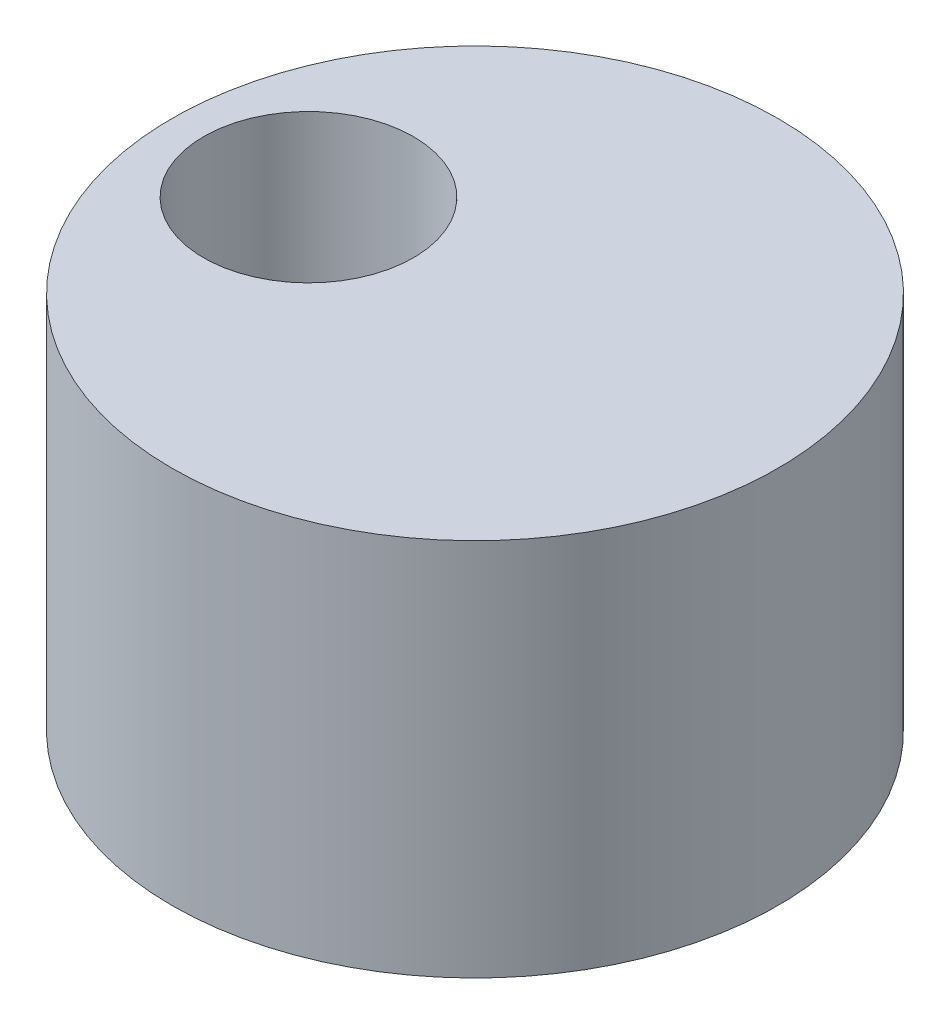
ISO-10303-21;
HEADER;
FILE_DESCRIPTION(('STEP AP214'),'2;1');
FILE_NAME('part.step','',(''),(''),'','','');
FILE_SCHEMA(('AUTOMOTIVE_DESIGN { 1 0 10303 214 1 1 1 1 }'));
ENDSEC;
DATA;
#1=APPLICATION_CONTEXT('core data for automotive mechanical design processes');
#2=APPLICATION_PROTOCOL_DEFINITION('international standard','automotive_design',2000,#1);
#3=PRODUCT_CONTEXT('',#1,'mechanical');
#4=PRODUCT('Part','Part','',(#3));
#5=PRODUCT_RELATED_PRODUCT_CATEGORY('part','',(#4));
#6=PRODUCT_DEFINITION_FORMATION('','',#4);
#7=PRODUCT_DEFINITION_CONTEXT('part definition',#1,'design');
#8=PRODUCT_DEFINITION('design','',#6,#7);
#9=PRODUCT_DEFINITION_SHAPE('','',#8);
#10=(LENGTH_UNIT() NAMED_UNIT(*) SI_UNIT(.MILLI.,.METRE.));
#11=(NAMED_UNIT(*) PLANE_ANGLE_UNIT() SI_UNIT($,.RADIAN.));
#12=(NAMED_UNIT(*) SI_UNIT($,.STERADIAN.) SOLID_ANGLE_UNIT());
#13=UNCERTAINTY_MEASURE_WITH_UNIT(LENGTH_MEASURE(1.E-05),#10,'distance_accuracy_value','');
#14=(GEOMETRIC_REPRESENTATION_CONTEXT(3) GLOBAL_UNCERTAINTY_ASSIGNED_CONTEXT((#13)) GLOBAL_UNIT_ASSIGNED_CONTEXT((#10,
#11,#12)) REPRESENTATION_CONTEXT('',''));
#15=CARTESIAN_POINT('',(0.,0.,0.));
#16=DIRECTION('',(0.,0.,1.));
#17=DIRECTION('',(1.,0.,0.));
#18=AXIS2_PLACEMENT_3D('',#15,#16,#17);
#19=CARTESIAN_POINT('',(0.,7.9375,0.));
#20=DIRECTION('',(0.,-1.,0.));
#21=DIRECTION('',(0.,0.,-1.));
#22=AXIS2_PLACEMENT_3D('',#19,#20,#21);
#23=CYLINDRICAL_SURFACE('',#22,6.35);
#24=CARTESIAN_POINT('',(0.,7.9375,0.));
#25=DIRECTION('',(0.,1.,0.));
#26=DIRECTION('',(0.,0.,1.));
#27=AXIS2_PLACEMENT_3D('',#24,#25,#26);
#28=CIRCLE('',#27,6.35);
#29=CARTESIAN_POINT('',(0.,7.9375,6.35));
#30=VERTEX_POINT('',#29);
#31=EDGE_CURVE('E10',#30,#30,#28,.T.);
#32=ORIENTED_EDGE('',*,*,#31,.F.);
#33=EDGE_LOOP('',(#32));
#34=FACE_BOUND('',#33,.T.);
#35=CARTESIAN_POINT('',(0.,0.,0.));
#36=DIRECTION('',(0.,1.,0.));
#37=DIRECTION('',(0.,0.,1.));
#38=AXIS2_PLACEMENT_3D('',#35,#36,#37);
#39=CIRCLE('',#38,6.35);
#40=CARTESIAN_POINT('',(0.,0.,6.35));
#41=VERTEX_POINT('',#40);
#42=EDGE_CURVE('E44',#41,#41,#39,.T.);
#43=ORIENTED_EDGE('',*,*,#42,.T.);
#44=EDGE_LOOP('',(#43));
#45=FACE_BOUND('',#44,.T.);
#46=ADVANCED_FACE('F41',(#34,#45),#23,.T.);
#47=CARTESIAN_POINT('',(0.,7.9375,0.));
#48=DIRECTION('',(0.,1.,0.));
#49=DIRECTION('',(0.,0.,1.));
#50=AXIS2_PLACEMENT_3D('',#47,#48,#49);
#51=PLANE('',#50);
#52=CARTESIAN_POINT('',(-3.49,7.9375,0.));
#53=DIRECTION('',(0.,-1.,0.));
#54=DIRECTION('',(0.,0.,-1.));
#55=AXIS2_PLACEMENT_3D('',#52,#53,#54);
#56=CIRCLE('',#55,2.2);
#57=CARTESIAN_POINT('',(-3.49,7.9375,-2.2));
#58=VERTEX_POINT('',#57);
#59=EDGE_CURVE('E53',#58,#58,#56,.T.);
#60=ORIENTED_EDGE('',*,*,#59,.T.);
#61=EDGE_LOOP('',(#60));
#62=FACE_BOUND('',#61,.T.);
#63=ORIENTED_EDGE('',*,*,#31,.T.);
#64=EDGE_LOOP('',(#63));
#65=FACE_BOUND('',#64,.T.);
#66=ADVANCED_FACE('F92',(#62,#65),#51,.T.);
#67=CARTESIAN_POINT('',(0.,0.,0.));
#68=DIRECTION('',(0.,1.,0.));
#69=DIRECTION('',(0.,0.,1.));
#70=AXIS2_PLACEMENT_3D('',#67,#68,#69);
#71=PLANE('',#70);
#72=CARTESIAN_POINT('',(-3.49,0.,-3.8));
#73=DIRECTION('',(0.,-1.,0.));
#74=DIRECTION('',(0.,0.,-1.));
#75=AXIS2_PLACEMENT_3D('',#72,#73,#74);
#76=CIRCLE('',#75,1.);
#77=CARTESIAN_POINT('',(-3.49,0.,-4.8));
#78=VERTEX_POINT('',#77);
#79=EDGE_CURVE('E71',#78,#78,#76,.T.);
#80=ORIENTED_EDGE('',*,*,#79,.F.);
#81=EDGE_LOOP('',(#80));
#82=FACE_BOUND('',#81,.T.);
#83=CARTESIAN_POINT('',(-3.49,0.,3.8));
#84=DIRECTION('',(0.,-1.,0.));
#85=DIRECTION('',(0.,0.,-1.));
#86=AXIS2_PLACEMENT_3D('',#83,#84,#85);
#87=CIRCLE('',#86,1.);
#88=CARTESIAN_POINT('',(-3.49,0.,2.8));
#89=VERTEX_POINT('',#88);
#90=EDGE_CURVE('E67',#89,#89,#87,.T.);
#91=ORIENTED_EDGE('',*,*,#90,.F.);
#92=EDGE_LOOP('',(#91));
#93=FACE_BOUND('',#92,.T.);
#94=CARTESIAN_POINT('',(-3.49,0.,0.));
#95=DIRECTION('',(0.,-1.,0.));
#96=DIRECTION('',(0.,0.,-1.));
#97=AXIS2_PLACEMENT_3D('',#94,#95,#96);
#98=CIRCLE('',#97,2.2);
#99=CARTESIAN_POINT('',(-3.49,0.,-2.2));
#100=VERTEX_POINT('',#99);
#101=EDGE_CURVE('E55',#100,#100,#98,.T.);
#102=ORIENTED_EDGE('',*,*,#101,.F.);
#103=EDGE_LOOP('',(#102));
#104=FACE_BOUND('',#103,.T.);
#105=ORIENTED_EDGE('',*,*,#42,.F.);
#106=EDGE_LOOP('',(#105));
#107=FACE_BOUND('',#106,.T.);
#108=ADVANCED_FACE('F88',(#82,#93,#104,#107),#71,.F.);
#109=CARTESIAN_POINT('',(-3.49,7.9375,0.));
#110=DIRECTION('',(0.,-1.,0.));
#111=DIRECTION('',(0.,0.,-1.));
#112=AXIS2_PLACEMENT_3D('',#109,#110,#111);
#113=CYLINDRICAL_SURFACE('',#112,2.2);
#114=ORIENTED_EDGE('',*,*,#59,.F.);
#115=EDGE_LOOP('',(#114));
#116=FACE_BOUND('',#115,.T.);
#117=ORIENTED_EDGE('',*,*,#101,.T.);
#118=EDGE_LOOP('',(#117));
#119=FACE_BOUND('',#118,.T.);
#120=ADVANCED_FACE('F91',(#116,#119),#113,.F.);
#121=CARTESIAN_POINT('',(-3.49,3.4,3.8));
#122=DIRECTION('',(0.,-1.,0.));
#123=DIRECTION('',(0.,0.,-1.));
#124=AXIS2_PLACEMENT_3D('',#121,#122,#123);
#125=CYLINDRICAL_SURFACE('',#124,1.);
#126=CARTESIAN_POINT('',(-3.49,3.4,3.8));
#127=DIRECTION('',(0.,-1.,0.));
#128=DIRECTION('',(0.,0.,-1.));
#129=AXIS2_PLACEMENT_3D('',#126,#127,#128);
#130=CIRCLE('',#129,1.);
#131=CARTESIAN_POINT('',(-3.49,3.4,2.8));
#132=VERTEX_POINT('',#131);
#133=EDGE_CURVE('E63',#132,#132,#130,.T.);
#134=ORIENTED_EDGE('',*,*,#133,.F.);
#135=EDGE_LOOP('',(#134));
#136=FACE_BOUND('',#135,.T.);
#137=ORIENTED_EDGE('',*,*,#90,.T.);
#138=EDGE_LOOP('',(#137));
#139=FACE_BOUND('',#138,.T.);
#140=ADVANCED_FACE('F111',(#136,#139),#125,.F.);
#141=CARTESIAN_POINT('',(-3.49,3.4,3.8));
#142=DIRECTION('',(0.,-1.,0.));
#143=DIRECTION('',(0.,0.,-1.));
#144=AXIS2_PLACEMENT_3D('',#141,#142,#143);
#145=PLANE('',#144);
#146=ORIENTED_EDGE('',*,*,#133,.T.);
#147=EDGE_LOOP('',(#146));
#148=FACE_BOUND('',#147,.T.);
#149=ADVANCED_FACE('F84',(#148),#145,.T.);
#150=CARTESIAN_POINT('',(-3.49,3.4,-3.8));
#151=DIRECTION('',(0.,-1.,0.));
#152=DIRECTION('',(0.,0.,-1.));
#153=AXIS2_PLACEMENT_3D('',#150,#151,#152);
#154=CYLINDRICAL_SURFACE('',#153,1.);
#155=CARTESIAN_POINT('',(-3.49,3.4,-3.8));
#156=DIRECTION('',(0.,-1.,0.));
#157=DIRECTION('',(0.,0.,-1.));
#158=AXIS2_PLACEMENT_3D('',#155,#156,#157);
#159=CIRCLE('',#158,1.);
#160=CARTESIAN_POINT('',(-3.49,3.4,-4.8));
#161=VERTEX_POINT('',#160);
#162=EDGE_CURVE('E59',#161,#161,#159,.T.);
#163=ORIENTED_EDGE('',*,*,#162,.F.);
#164=EDGE_LOOP('',(#163));
#165=FACE_BOUND('',#164,.T.);
#166=ORIENTED_EDGE('',*,*,#79,.T.);
#167=EDGE_LOOP('',(#166));
#168=FACE_BOUND('',#167,.T.);
#169=ADVANCED_FACE('F81',(#165,#168),#154,.F.);
#170=CARTESIAN_POINT('',(-3.49,3.4,-3.8));
#171=DIRECTION('',(0.,-1.,0.));
#172=DIRECTION('',(0.,0.,-1.));
#173=AXIS2_PLACEMENT_3D('',#170,#171,#172);
#174=PLANE('',#173);
#175=ORIENTED_EDGE('',*,*,#162,.T.);
#176=EDGE_LOOP('',(#175));
#177=FACE_BOUND('',#176,.T.);
#178=ADVANCED_FACE('F79',(#177),#174,.T.);
#179=CLOSED_SHELL('',(#46,#66,#108,#120,#140,#149,#169,#178));
#180=MANIFOLD_SOLID_BREP('B2',#179);
#181=ADVANCED_BREP_SHAPE_REPRESENTATION('',(#18,#180),#14);
#182=SHAPE_DEFINITION_REPRESENTATION(#9,#181);
ENDSEC;
END-ISO-10303-21;
